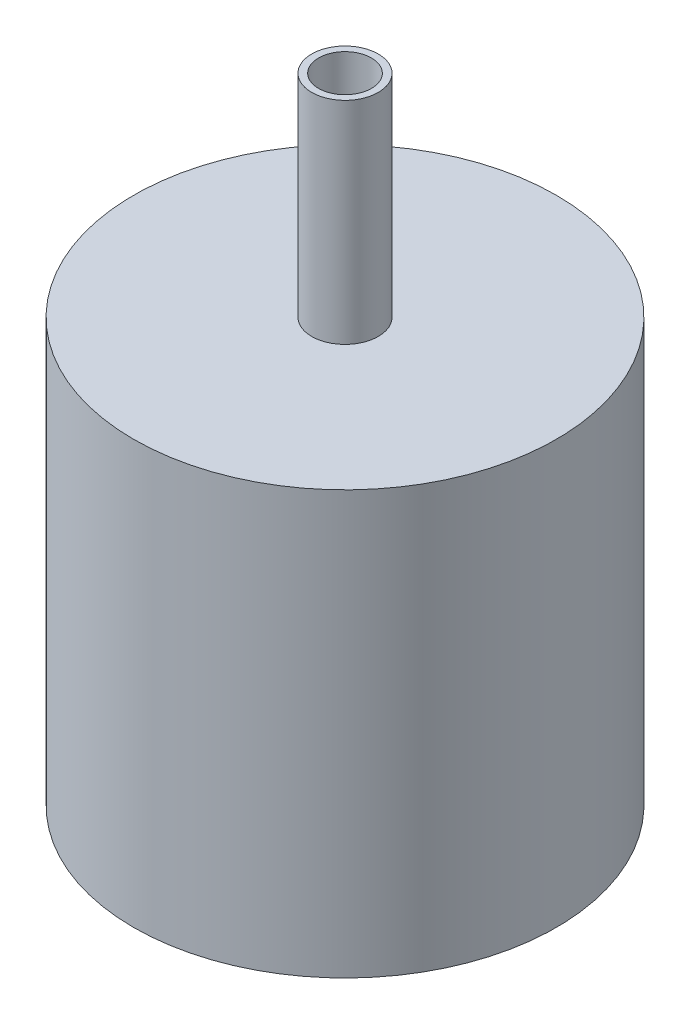
ISO-10303-21;
HEADER;
FILE_DESCRIPTION(('STEP AP214'),'2;1');
FILE_NAME('part.step','',(''),(''),'','','');
FILE_SCHEMA(('AUTOMOTIVE_DESIGN { 1 0 10303 214 1 1 1 1 }'));
ENDSEC;
DATA;
#1=APPLICATION_CONTEXT('core data for automotive mechanical design processes');
#2=APPLICATION_PROTOCOL_DEFINITION('international standard','automotive_design',2000,#1);
#3=PRODUCT_CONTEXT('',#1,'mechanical');
#4=PRODUCT('Part','Part','',(#3));
#5=PRODUCT_RELATED_PRODUCT_CATEGORY('part','',(#4));
#6=PRODUCT_DEFINITION_FORMATION('','',#4);
#7=PRODUCT_DEFINITION_CONTEXT('part definition',#1,'design');
#8=PRODUCT_DEFINITION('design','',#6,#7);
#9=PRODUCT_DEFINITION_SHAPE('','',#8);
#10=(LENGTH_UNIT() NAMED_UNIT(*) SI_UNIT(.MILLI.,.METRE.));
#11=(NAMED_UNIT(*) PLANE_ANGLE_UNIT() SI_UNIT($,.RADIAN.));
#12=(NAMED_UNIT(*) SI_UNIT($,.STERADIAN.) SOLID_ANGLE_UNIT());
#13=UNCERTAINTY_MEASURE_WITH_UNIT(LENGTH_MEASURE(1.E-05),#10,'distance_accuracy_value','');
#14=(GEOMETRIC_REPRESENTATION_CONTEXT(3) GLOBAL_UNCERTAINTY_ASSIGNED_CONTEXT((#13)) GLOBAL_UNIT_ASSIGNED_CONTEXT((#10,
#11,#12)) REPRESENTATION_CONTEXT('',''));
#15=CARTESIAN_POINT('',(0.,0.,0.));
#16=DIRECTION('',(0.,0.,1.));
#17=DIRECTION('',(1.,0.,0.));
#18=AXIS2_PLACEMENT_3D('',#15,#16,#17);
#19=CARTESIAN_POINT('',(0.,25.4,0.));
#20=DIRECTION('',(0.,-1.,0.));
#21=DIRECTION('',(0.,0.,-1.));
#22=AXIS2_PLACEMENT_3D('',#19,#20,#21);
#23=CYLINDRICAL_SURFACE('',#22,12.7);
#24=CARTESIAN_POINT('',(0.,25.4,0.));
#25=DIRECTION('',(0.,1.,0.));
#26=DIRECTION('',(0.,0.,1.));
#27=AXIS2_PLACEMENT_3D('',#24,#25,#26);
#28=CIRCLE('',#27,12.7);
#29=CARTESIAN_POINT('',(0.,25.4,12.7));
#30=VERTEX_POINT('',#29);
#31=EDGE_CURVE('E38',#30,#30,#28,.T.);
#32=ORIENTED_EDGE('',*,*,#31,.F.);
#33=EDGE_LOOP('',(#32));
#34=FACE_BOUND('',#33,.T.);
#35=CARTESIAN_POINT('',(0.,0.,0.));
#36=DIRECTION('',(0.,1.,0.));
#37=DIRECTION('',(0.,0.,1.));
#38=AXIS2_PLACEMENT_3D('',#35,#36,#37);
#39=CIRCLE('',#38,12.7);
#40=CARTESIAN_POINT('',(0.,0.,12.7));
#41=VERTEX_POINT('',#40);
#42=EDGE_CURVE('E34',#41,#41,#39,.T.);
#43=ORIENTED_EDGE('',*,*,#42,.T.);
#44=EDGE_LOOP('',(#43));
#45=FACE_BOUND('',#44,.T.);
#46=ADVANCED_FACE('F31',(#34,#45),#23,.T.);
#47=CARTESIAN_POINT('',(0.,25.4,0.));
#48=DIRECTION('',(0.,1.,0.));
#49=DIRECTION('',(0.,0.,1.));
#50=AXIS2_PLACEMENT_3D('',#47,#48,#49);
#51=PLANE('',#50);
#52=CARTESIAN_POINT('',(0.,25.4,0.));
#53=DIRECTION('',(0.,1.,0.));
#54=DIRECTION('',(0.,0.,1.));
#55=AXIS2_PLACEMENT_3D('',#52,#53,#54);
#56=CIRCLE('',#55,1.999996);
#57=CARTESIAN_POINT('',(0.,25.4,1.999996));
#58=VERTEX_POINT('',#57);
#59=EDGE_CURVE('E10',#58,#58,#56,.T.);
#60=ORIENTED_EDGE('',*,*,#59,.F.);
#61=EDGE_LOOP('',(#60));
#62=FACE_BOUND('',#61,.T.);
#63=ORIENTED_EDGE('',*,*,#31,.T.);
#64=EDGE_LOOP('',(#63));
#65=FACE_BOUND('',#64,.T.);
#66=ADVANCED_FACE('F83',(#62,#65),#51,.T.);
#67=CARTESIAN_POINT('',(0.,0.,0.));
#68=DIRECTION('',(0.,1.,0.));
#69=DIRECTION('',(0.,0.,1.));
#70=AXIS2_PLACEMENT_3D('',#67,#68,#69);
#71=PLANE('',#70);
#72=CARTESIAN_POINT('',(0.,0.,0.));
#73=DIRECTION('',(0.,1.,0.));
#74=DIRECTION('',(0.,0.,1.));
#75=AXIS2_PLACEMENT_3D('',#72,#73,#74);
#76=CIRCLE('',#75,7.9375);
#77=CARTESIAN_POINT('',(0.,0.,7.9375));
#78=VERTEX_POINT('',#77);
#79=EDGE_CURVE('E50',#78,#78,#76,.T.);
#80=ORIENTED_EDGE('',*,*,#79,.T.);
#81=EDGE_LOOP('',(#80));
#82=FACE_BOUND('',#81,.T.);
#83=ORIENTED_EDGE('',*,*,#42,.F.);
#84=EDGE_LOOP('',(#83));
#85=FACE_BOUND('',#84,.T.);
#86=ADVANCED_FACE('F78',(#82,#85),#71,.F.);
#87=CARTESIAN_POINT('',(0.,3.175,0.));
#88=DIRECTION('',(0.,-1.,0.));
#89=DIRECTION('',(0.,0.,-1.));
#90=AXIS2_PLACEMENT_3D('',#87,#88,#89);
#91=CYLINDRICAL_SURFACE('',#90,7.9375);
#92=CARTESIAN_POINT('',(0.,3.175,0.));
#93=DIRECTION('',(0.,1.,0.));
#94=DIRECTION('',(0.,0.,1.));
#95=AXIS2_PLACEMENT_3D('',#92,#93,#94);
#96=CIRCLE('',#95,7.9375);
#97=CARTESIAN_POINT('',(0.,3.175,7.9375));
#98=VERTEX_POINT('',#97);
#99=EDGE_CURVE('E47',#98,#98,#96,.T.);
#100=ORIENTED_EDGE('',*,*,#99,.T.);
#101=EDGE_LOOP('',(#100));
#102=FACE_BOUND('',#101,.T.);
#103=ORIENTED_EDGE('',*,*,#79,.F.);
#104=EDGE_LOOP('',(#103));
#105=FACE_BOUND('',#104,.T.);
#106=ADVANCED_FACE('F72',(#102,#105),#91,.F.);
#107=CARTESIAN_POINT('',(0.,3.175,0.));
#108=DIRECTION('',(0.,1.,0.));
#109=DIRECTION('',(0.,0.,1.));
#110=AXIS2_PLACEMENT_3D('',#107,#108,#109);
#111=PLANE('',#110);
#112=CARTESIAN_POINT('',(0.,3.175,0.));
#113=DIRECTION('',(0.,-1.,0.));
#114=DIRECTION('',(0.,0.,-1.));
#115=AXIS2_PLACEMENT_3D('',#112,#113,#114);
#116=CIRCLE('',#115,1.58749999999999);
#117=CARTESIAN_POINT('',(0.,3.175,-1.58749999999999));
#118=VERTEX_POINT('',#117);
#119=EDGE_CURVE('E59',#118,#118,#116,.T.);
#120=ORIENTED_EDGE('',*,*,#119,.F.);
#121=EDGE_LOOP('',(#120));
#122=FACE_BOUND('',#121,.T.);
#123=ORIENTED_EDGE('',*,*,#99,.F.);
#124=EDGE_LOOP('',(#123));
#125=FACE_BOUND('',#124,.T.);
#126=ADVANCED_FACE('F68',(#122,#125),#111,.F.);
#127=CARTESIAN_POINT('',(0.,38.1,0.));
#128=DIRECTION('',(0.,-1.,0.));
#129=DIRECTION('',(0.,0.,-1.));
#130=AXIS2_PLACEMENT_3D('',#127,#128,#129);
#131=CYLINDRICAL_SURFACE('',#130,1.999996);
#132=CARTESIAN_POINT('',(0.,38.1,0.));
#133=DIRECTION('',(0.,1.,0.));
#134=DIRECTION('',(0.,0.,1.));
#135=AXIS2_PLACEMENT_3D('',#132,#133,#134);
#136=CIRCLE('',#135,1.999996);
#137=CARTESIAN_POINT('',(0.,38.1,1.999996));
#138=VERTEX_POINT('',#137);
#139=EDGE_CURVE('E45',#138,#138,#136,.T.);
#140=ORIENTED_EDGE('',*,*,#139,.F.);
#141=EDGE_LOOP('',(#140));
#142=FACE_BOUND('',#141,.T.);
#143=ORIENTED_EDGE('',*,*,#59,.T.);
#144=EDGE_LOOP('',(#143));
#145=FACE_BOUND('',#144,.T.);
#146=ADVANCED_FACE('F71',(#142,#145),#131,.T.);
#147=CARTESIAN_POINT('',(0.,38.1,0.));
#148=DIRECTION('',(0.,1.,0.));
#149=DIRECTION('',(0.,0.,1.));
#150=AXIS2_PLACEMENT_3D('',#147,#148,#149);
#151=PLANE('',#150);
#152=CARTESIAN_POINT('',(0.,38.1,0.));
#153=DIRECTION('',(0.,-1.,0.));
#154=DIRECTION('',(0.,0.,-1.));
#155=AXIS2_PLACEMENT_3D('',#152,#153,#154);
#156=CIRCLE('',#155,1.58749999999999);
#157=CARTESIAN_POINT('',(0.,38.1,-1.58749999999999));
#158=VERTEX_POINT('',#157);
#159=EDGE_CURVE('E55',#158,#158,#156,.T.);
#160=ORIENTED_EDGE('',*,*,#159,.T.);
#161=EDGE_LOOP('',(#160));
#162=FACE_BOUND('',#161,.T.);
#163=ORIENTED_EDGE('',*,*,#139,.T.);
#164=EDGE_LOOP('',(#163));
#165=FACE_BOUND('',#164,.T.);
#166=ADVANCED_FACE('F125',(#162,#165),#151,.T.);
#167=CARTESIAN_POINT('',(0.,3.175,0.));
#168=DIRECTION('',(0.,-1.,0.));
#169=DIRECTION('',(0.,0.,-1.));
#170=AXIS2_PLACEMENT_3D('',#167,#168,#169);
#171=CYLINDRICAL_SURFACE('',#170,1.58749999999999);
#172=ORIENTED_EDGE('',*,*,#159,.F.);
#173=EDGE_LOOP('',(#172));
#174=FACE_BOUND('',#173,.T.);
#175=ORIENTED_EDGE('',*,*,#119,.T.);
#176=EDGE_LOOP('',(#175));
#177=FACE_BOUND('',#176,.T.);
#178=ADVANCED_FACE('F66',(#174,#177),#171,.F.);
#179=CLOSED_SHELL('',(#46,#66,#86,#106,#126,#146,#166,#178));
#180=MANIFOLD_SOLID_BREP('B2',#179);
#181=ADVANCED_BREP_SHAPE_REPRESENTATION('',(#18,#180),#14);
#182=SHAPE_DEFINITION_REPRESENTATION(#9,#181);
ENDSEC;
END-ISO-10303-21;
